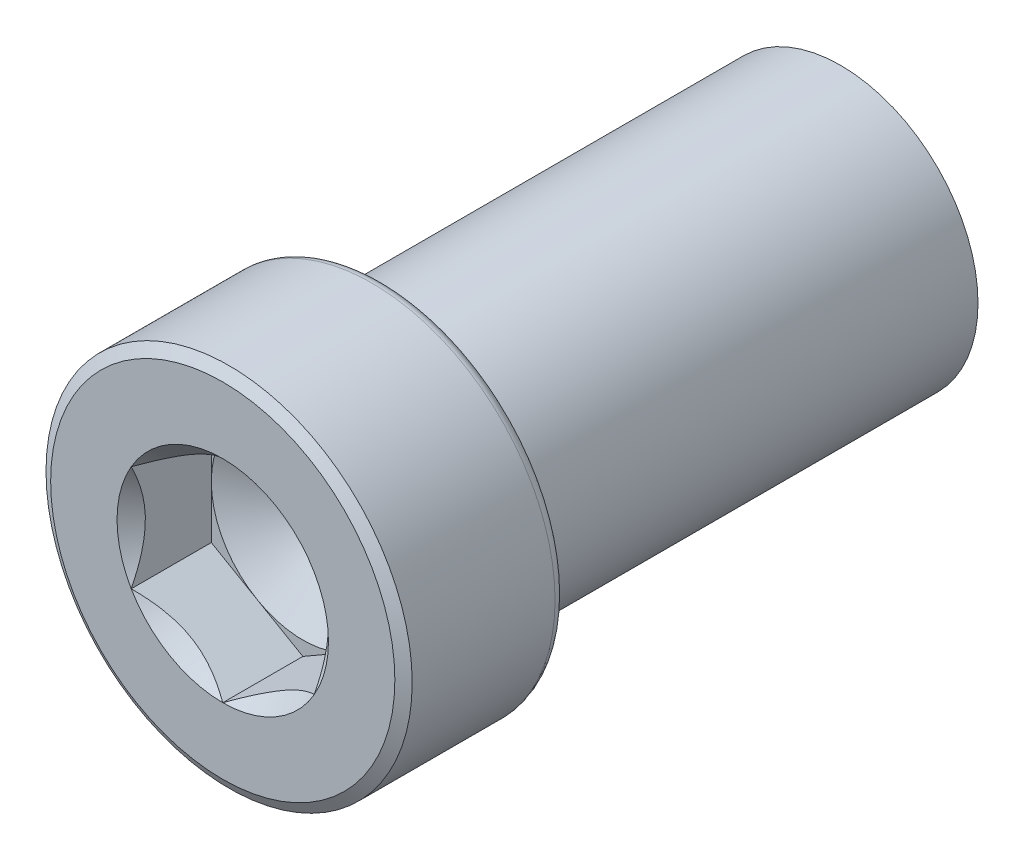
ISO-10303-21;
HEADER;
FILE_DESCRIPTION(('STEP AP214'),'2;1');
FILE_NAME('part.step','',(''),(''),'','','');
FILE_SCHEMA(('AUTOMOTIVE_DESIGN { 1 0 10303 214 1 1 1 1 }'));
ENDSEC;
DATA;
#1=APPLICATION_CONTEXT('core data for automotive mechanical design processes');
#2=APPLICATION_PROTOCOL_DEFINITION('international standard','automotive_design',2000,#1);
#3=PRODUCT_CONTEXT('',#1,'mechanical');
#4=PRODUCT('Part','Part','',(#3));
#5=PRODUCT_RELATED_PRODUCT_CATEGORY('part','',(#4));
#6=PRODUCT_DEFINITION_FORMATION('','',#4);
#7=PRODUCT_DEFINITION_CONTEXT('part definition',#1,'design');
#8=PRODUCT_DEFINITION('design','',#6,#7);
#9=PRODUCT_DEFINITION_SHAPE('','',#8);
#10=(LENGTH_UNIT() NAMED_UNIT(*) SI_UNIT(.MILLI.,.METRE.));
#11=(NAMED_UNIT(*) PLANE_ANGLE_UNIT() SI_UNIT($,.RADIAN.));
#12=(NAMED_UNIT(*) SI_UNIT($,.STERADIAN.) SOLID_ANGLE_UNIT());
#13=UNCERTAINTY_MEASURE_WITH_UNIT(LENGTH_MEASURE(1.E-05),#10,'distance_accuracy_value','');
#14=(GEOMETRIC_REPRESENTATION_CONTEXT(3) GLOBAL_UNCERTAINTY_ASSIGNED_CONTEXT((#13)) GLOBAL_UNIT_ASSIGNED_CONTEXT((#10,
#11,#12)) REPRESENTATION_CONTEXT('',''));
#15=CARTESIAN_POINT('',(0.,0.,0.));
#16=DIRECTION('',(0.,0.,1.));
#17=DIRECTION('',(1.,0.,0.));
#18=AXIS2_PLACEMENT_3D('',#15,#16,#17);
#19=CARTESIAN_POINT('',(-8.00000000000001,0.,3.5));
#20=DIRECTION('',(0.,0.,-1.));
#21=DIRECTION('',(-0.999999999999999,0.,0.));
#22=AXIS2_PLACEMENT_3D('',#19,#20,#21);
#23=PLANE('',#22);
#24=CARTESIAN_POINT('',(0.,0.,3.5));
#25=DIRECTION('',(0.,0.,1.));
#26=DIRECTION('',(0.999999999999999,0.,0.));
#27=AXIS2_PLACEMENT_3D('',#24,#25,#26);
#28=CIRCLE('',#27,4.);
#29=CARTESIAN_POINT('',(4.,0.,3.5));
#30=VERTEX_POINT('',#29);
#31=CARTESIAN_POINT('',(2.,3.46410161513773,3.5));
#32=VERTEX_POINT('',#31);
#33=EDGE_CURVE('E61',#30,#32,#28,.T.);
#34=ORIENTED_EDGE('',*,*,#33,.F.);
#35=DIRECTION('',(0.,1.,0.));
#36=VECTOR('',#35,1.);
#37=CARTESIAN_POINT('',(4.,-2.3094010767585,3.5));
#38=LINE('',#37,#36);
#39=CARTESIAN_POINT('',(4.,2.3094010767585,3.5));
#40=VERTEX_POINT('',#39);
#41=EDGE_CURVE('E131',#30,#40,#38,.T.);
#42=ORIENTED_EDGE('',*,*,#41,.T.);
#43=DIRECTION('',(-0.866025403784438,0.5,0.));
#44=VECTOR('',#43,1.);
#45=CARTESIAN_POINT('',(4.,2.3094010767585,3.5));
#46=LINE('',#45,#44);
#47=EDGE_CURVE('E134',#40,#32,#46,.T.);
#48=ORIENTED_EDGE('',*,*,#47,.T.);
#49=EDGE_LOOP('',(#34,#42,#48));
#50=FACE_BOUND('',#49,.T.);
#51=ADVANCED_FACE('F50',(#50),#23,.F.);
#52=CARTESIAN_POINT('',(-2.,3.4641016151377,3.5));
#53=VERTEX_POINT('',#52);
#54=EDGE_CURVE('E13',#32,#53,#28,.T.);
#55=ORIENTED_EDGE('',*,*,#54,.F.);
#56=CARTESIAN_POINT('',(0.,4.61880215351694,3.5));
#57=VERTEX_POINT('',#56);
#58=EDGE_CURVE('E148',#32,#57,#46,.T.);
#59=ORIENTED_EDGE('',*,*,#58,.T.);
#60=DIRECTION('',(-0.866025403784438,-0.5,0.));
#61=VECTOR('',#60,1.);
#62=CARTESIAN_POINT('',(0.,4.61880215351694,3.5));
#63=LINE('',#62,#61);
#64=EDGE_CURVE('E154',#57,#53,#63,.T.);
#65=ORIENTED_EDGE('',*,*,#64,.T.);
#66=EDGE_LOOP('',(#55,#59,#65));
#67=FACE_BOUND('',#66,.T.);
#68=ADVANCED_FACE('F212',(#67),#23,.F.);
#69=CARTESIAN_POINT('',(-4.,0.,3.5));
#70=VERTEX_POINT('',#69);
#71=EDGE_CURVE('E59',#53,#70,#28,.T.);
#72=ORIENTED_EDGE('',*,*,#71,.F.);
#73=CARTESIAN_POINT('',(-4.,2.3094010767585,3.5));
#74=VERTEX_POINT('',#73);
#75=EDGE_CURVE('E153',#53,#74,#63,.T.);
#76=ORIENTED_EDGE('',*,*,#75,.T.);
#77=DIRECTION('',(0.,-1.,0.));
#78=VECTOR('',#77,1.);
#79=CARTESIAN_POINT('',(-4.,2.3094010767585,3.5));
#80=LINE('',#79,#78);
#81=EDGE_CURVE('E158',#74,#70,#80,.T.);
#82=ORIENTED_EDGE('',*,*,#81,.T.);
#83=EDGE_LOOP('',(#72,#76,#82));
#84=FACE_BOUND('',#83,.T.);
#85=ADVANCED_FACE('F217',(#84),#23,.F.);
#86=CARTESIAN_POINT('',(-2.,-3.46410161513776,3.5));
#87=VERTEX_POINT('',#86);
#88=EDGE_CURVE('E241',#70,#87,#28,.T.);
#89=ORIENTED_EDGE('',*,*,#88,.F.);
#90=CARTESIAN_POINT('',(-4.,-2.3094010767585,3.5));
#91=VERTEX_POINT('',#90);
#92=EDGE_CURVE('E157',#70,#91,#80,.T.);
#93=ORIENTED_EDGE('',*,*,#92,.T.);
#94=DIRECTION('',(0.866025403784438,-0.5,0.));
#95=VECTOR('',#94,1.);
#96=CARTESIAN_POINT('',(-4.,-2.3094010767585,3.5));
#97=LINE('',#96,#95);
#98=EDGE_CURVE('E246',#91,#87,#97,.T.);
#99=ORIENTED_EDGE('',*,*,#98,.T.);
#100=EDGE_LOOP('',(#89,#93,#99));
#101=FACE_BOUND('',#100,.T.);
#102=ADVANCED_FACE('F230',(#101),#23,.F.);
#103=CARTESIAN_POINT('',(2.,-3.46410161513776,3.5));
#104=VERTEX_POINT('',#103);
#105=EDGE_CURVE('E68',#87,#104,#28,.T.);
#106=ORIENTED_EDGE('',*,*,#105,.F.);
#107=CARTESIAN_POINT('',(0.,-4.61880215351701,3.5));
#108=VERTEX_POINT('',#107);
#109=EDGE_CURVE('E238',#87,#108,#97,.T.);
#110=ORIENTED_EDGE('',*,*,#109,.T.);
#111=DIRECTION('',(0.866025403784438,0.5,0.));
#112=VECTOR('',#111,1.);
#113=CARTESIAN_POINT('',(0.,-4.61880215351701,3.5));
#114=LINE('',#113,#112);
#115=EDGE_CURVE('E143',#108,#104,#114,.T.);
#116=ORIENTED_EDGE('',*,*,#115,.T.);
#117=EDGE_LOOP('',(#106,#110,#116));
#118=FACE_BOUND('',#117,.T.);
#119=ADVANCED_FACE('F222',(#118),#23,.F.);
#120=EDGE_CURVE('E121',#104,#30,#28,.T.);
#121=ORIENTED_EDGE('',*,*,#120,.F.);
#122=CARTESIAN_POINT('',(4.,-2.3094010767585,3.5));
#123=VERTEX_POINT('',#122);
#124=EDGE_CURVE('E146',#104,#123,#114,.T.);
#125=ORIENTED_EDGE('',*,*,#124,.T.);
#126=EDGE_CURVE('E139',#123,#30,#38,.T.);
#127=ORIENTED_EDGE('',*,*,#126,.T.);
#128=EDGE_LOOP('',(#121,#125,#127));
#129=FACE_BOUND('',#128,.T.);
#130=ADVANCED_FACE('F145',(#129),#23,.F.);
#131=CARTESIAN_POINT('',(0.,0.,0.));
#132=DIRECTION('',(0.,0.,-1.));
#133=DIRECTION('',(0.,1.,0.));
#134=AXIS2_PLACEMENT_3D('',#131,#132,#133);
#135=CYLINDRICAL_SURFACE('',#134,6.);
#136=CARTESIAN_POINT('',(0.,0.,0.));
#137=DIRECTION('',(0.,0.,1.));
#138=DIRECTION('',(0.999999999999999,0.,0.));
#139=AXIS2_PLACEMENT_3D('',#136,#137,#138);
#140=CIRCLE('',#139,6.);
#141=CARTESIAN_POINT('',(5.99999999999999,0.,0.));
#142=VERTEX_POINT('',#141);
#143=EDGE_CURVE('E165',#142,#142,#140,.F.);
#144=ORIENTED_EDGE('',*,*,#143,.T.);
#145=EDGE_LOOP('',(#144));
#146=FACE_BOUND('',#145,.T.);
#147=CARTESIAN_POINT('',(0.,0.,-20.));
#148=DIRECTION('',(0.,0.,-1.));
#149=DIRECTION('',(0.,1.,0.));
#150=AXIS2_PLACEMENT_3D('',#147,#148,#149);
#151=CIRCLE('',#150,6.);
#152=CARTESIAN_POINT('',(0.,6.,-20.));
#153=VERTEX_POINT('',#152);
#154=EDGE_CURVE('E179',#153,#153,#151,.T.);
#155=ORIENTED_EDGE('',*,*,#154,.F.);
#156=EDGE_LOOP('',(#155));
#157=FACE_BOUND('',#156,.T.);
#158=ADVANCED_FACE('F221',(#146,#157),#135,.T.);
#159=CARTESIAN_POINT('',(0.,0.,-20.));
#160=DIRECTION('',(0.,0.,-1.));
#161=DIRECTION('',(0.,1.,0.));
#162=AXIS2_PLACEMENT_3D('',#159,#160,#161);
#163=PLANE('',#162);
#164=ORIENTED_EDGE('',*,*,#154,.T.);
#165=EDGE_LOOP('',(#164));
#166=FACE_BOUND('',#165,.T.);
#167=ADVANCED_FACE('F227',(#166),#163,.T.);
#168=CARTESIAN_POINT('',(0.,0.,7.));
#169=DIRECTION('',(0.,0.,-1.));
#170=DIRECTION('',(-0.999999999999999,0.,0.));
#171=AXIS2_PLACEMENT_3D('',#168,#169,#170);
#172=CYLINDRICAL_SURFACE('',#171,8.);
#173=CARTESIAN_POINT('',(0.,0.,6.72287187078898));
#174=DIRECTION('',(0.,0.,1.));
#175=DIRECTION('',(0.999999999999999,0.,0.));
#176=AXIS2_PLACEMENT_3D('',#173,#174,#175);
#177=CIRCLE('',#176,8.);
#178=CARTESIAN_POINT('',(7.99999999999999,0.,6.72287187078898));
#179=VERTEX_POINT('',#178);
#180=EDGE_CURVE('E54',#179,#179,#177,.F.);
#181=ORIENTED_EDGE('',*,*,#180,.T.);
#182=EDGE_LOOP('',(#181));
#183=FACE_BOUND('',#182,.T.);
#184=CARTESIAN_POINT('',(0.,0.,0.480000000000001));
#185=DIRECTION('',(0.,0.,1.));
#186=DIRECTION('',(0.999999999999999,0.,0.));
#187=AXIS2_PLACEMENT_3D('',#184,#185,#186);
#188=CIRCLE('',#187,8.);
#189=CARTESIAN_POINT('',(7.99999999999999,0.,0.480000000000001));
#190=VERTEX_POINT('',#189);
#191=EDGE_CURVE('E182',#190,#190,#188,.T.);
#192=ORIENTED_EDGE('',*,*,#191,.T.);
#193=EDGE_LOOP('',(#192));
#194=FACE_BOUND('',#193,.T.);
#195=ADVANCED_FACE('F194',(#183,#194),#172,.T.);
#196=CARTESIAN_POINT('',(0.,0.,7.));
#197=DIRECTION('',(0.,0.,1.));
#198=DIRECTION('',(0.999999999999999,0.,0.));
#199=AXIS2_PLACEMENT_3D('',#196,#197,#198);
#200=PLANE('',#199);
#201=CARTESIAN_POINT('',(0.,0.,7.));
#202=DIRECTION('',(0.,0.,1.));
#203=DIRECTION('',(0.999999999999999,0.,0.));
#204=AXIS2_PLACEMENT_3D('',#201,#202,#203);
#205=CIRCLE('',#204,4.61880215351701);
#206=CARTESIAN_POINT('',(4.,2.3094010767585,6.99999999999999));
#207=VERTEX_POINT('',#206);
#208=CARTESIAN_POINT('',(0.,4.61880215351697,6.99999999999999));
#209=VERTEX_POINT('',#208);
#210=EDGE_CURVE('E332',#207,#209,#205,.T.);
#211=ORIENTED_EDGE('',*,*,#210,.F.);
#212=CARTESIAN_POINT('',(4.,-2.3094010767585,7.));
#213=VERTEX_POINT('',#212);
#214=EDGE_CURVE('E330',#213,#207,#205,.T.);
#215=ORIENTED_EDGE('',*,*,#214,.F.);
#216=CARTESIAN_POINT('',(0.,-4.61880215351701,7.));
#217=VERTEX_POINT('',#216);
#218=EDGE_CURVE('E326',#217,#213,#205,.T.);
#219=ORIENTED_EDGE('',*,*,#218,.F.);
#220=CARTESIAN_POINT('',(-4.,-2.3094010767585,7.00000000000001));
#221=VERTEX_POINT('',#220);
#222=EDGE_CURVE('E329',#221,#217,#205,.T.);
#223=ORIENTED_EDGE('',*,*,#222,.F.);
#224=CARTESIAN_POINT('',(-4.,2.3094010767585,7.));
#225=VERTEX_POINT('',#224);
#226=EDGE_CURVE('E75',#225,#221,#205,.T.);
#227=ORIENTED_EDGE('',*,*,#226,.F.);
#228=EDGE_CURVE('E334',#209,#225,#205,.T.);
#229=ORIENTED_EDGE('',*,*,#228,.F.);
#230=EDGE_LOOP('',(#211,#215,#219,#223,#227,#229));
#231=FACE_BOUND('',#230,.T.);
#232=CARTESIAN_POINT('',(0.,0.,7.));
#233=DIRECTION('',(0.,0.,1.));
#234=DIRECTION('',(0.999999999999999,0.,0.));
#235=AXIS2_PLACEMENT_3D('',#232,#233,#234);
#236=CIRCLE('',#235,7.52);
#237=CARTESIAN_POINT('',(7.51999999999999,0.,7.));
#238=VERTEX_POINT('',#237);
#239=EDGE_CURVE('E187',#238,#238,#236,.T.);
#240=ORIENTED_EDGE('',*,*,#239,.T.);
#241=EDGE_LOOP('',(#240));
#242=FACE_BOUND('',#241,.T.);
#243=ADVANCED_FACE('F328',(#231,#242),#200,.T.);
#244=CARTESIAN_POINT('',(0.,0.,0.));
#245=DIRECTION('',(0.,0.,1.));
#246=DIRECTION('',(0.999999999999999,0.,0.));
#247=AXIS2_PLACEMENT_3D('',#244,#245,#246);
#248=PLANE('',#247);
#249=CARTESIAN_POINT('',(0.,0.,0.));
#250=DIRECTION('',(0.,0.,1.));
#251=DIRECTION('',(0.999999999999999,0.,0.));
#252=AXIS2_PLACEMENT_3D('',#249,#250,#251);
#253=CIRCLE('',#252,7.52);
#254=CARTESIAN_POINT('',(7.52,0.,0.));
#255=VERTEX_POINT('',#254);
#256=EDGE_CURVE('E185',#255,#255,#253,.F.);
#257=ORIENTED_EDGE('',*,*,#256,.T.);
#258=EDGE_LOOP('',(#257));
#259=FACE_BOUND('',#258,.T.);
#260=ORIENTED_EDGE('',*,*,#143,.F.);
#261=EDGE_LOOP('',(#260));
#262=FACE_BOUND('',#261,.T.);
#263=ADVANCED_FACE('F209',(#259,#262),#248,.F.);
#264=CARTESIAN_POINT('',(0.,0.,0.480000000000001));
#265=DIRECTION('',(0.,0.,1.));
#266=DIRECTION('',(0.999999999999999,0.,0.));
#267=AXIS2_PLACEMENT_3D('',#264,#265,#266);
#268=TOROIDAL_SURFACE('',#267,7.52,0.48);
#269=ORIENTED_EDGE('',*,*,#256,.F.);
#270=EDGE_LOOP('',(#269));
#271=FACE_BOUND('',#270,.T.);
#272=ORIENTED_EDGE('',*,*,#191,.F.);
#273=EDGE_LOOP('',(#272));
#274=FACE_BOUND('',#273,.T.);
#275=ADVANCED_FACE('F200',(#271,#274),#268,.T.);
#276=CARTESIAN_POINT('',(0.,0.,7.));
#277=DIRECTION('',(0.,0.,-1.));
#278=DIRECTION('',(-0.999999999999999,0.,0.));
#279=AXIS2_PLACEMENT_3D('',#276,#277,#278);
#280=CONICAL_SURFACE('',#279,7.52,1.0471975511966);
#281=ORIENTED_EDGE('',*,*,#180,.F.);
#282=EDGE_LOOP('',(#281));
#283=FACE_BOUND('',#282,.T.);
#284=ORIENTED_EDGE('',*,*,#239,.F.);
#285=EDGE_LOOP('',(#284));
#286=FACE_BOUND('',#285,.T.);
#287=ADVANCED_FACE('F52',(#283,#286),#280,.T.);
#288=CARTESIAN_POINT('',(0.,0.,7.));
#289=DIRECTION('',(0.,0.,1.));
#290=DIRECTION('',(0.999999999999999,0.,0.));
#291=AXIS2_PLACEMENT_3D('',#288,#289,#290);
#292=CONICAL_SURFACE('',#291,4.61880215351701,0.78539816339745);
#293=ORIENTED_EDGE('',*,*,#218,.T.);
#294=CARTESIAN_POINT('',(-0.000200000000005751,-4.61891762357085,7.00011547438386));
#295=CARTESIAN_POINT('',(0.0685809847183788,-4.57920690352856,6.96040885595756));
#296=CARTESIAN_POINT('',(0.137888304896497,-4.53919230356692,6.92192041711315));
#297=CARTESIAN_POINT('',(0.27766403676359,-4.45849274714727,6.84775122373551));
#298=CARTESIAN_POINT('',(0.348133057578701,-4.41780743901014,6.81207200273165));
#299=CARTESIAN_POINT('',(0.562100081603898,-4.29427352009149,6.709500867651));
#300=CARTESIAN_POINT('',(0.707416589267741,-4.21037499527407,6.64751311101257));
#301=CARTESIAN_POINT('',(1.00040214981325,-4.04121970302445,6.54135586900941));
#302=CARTESIAN_POINT('',(1.14799719663764,-3.95600566300934,6.49691905545344));
#303=CARTESIAN_POINT('',(1.44644641508886,-3.78369592639708,6.42844898212945));
#304=CARTESIAN_POINT('',(1.59729144640343,-3.69660550696169,6.4043646378613));
#305=CARTESIAN_POINT('',(1.85726690511356,-3.54650860589271,6.38263488086053));
#306=CARTESIAN_POINT('',(1.96606238220553,-3.48369550790705,6.37941891464086));
#307=CARTESIAN_POINT('',(2.18347675426333,-3.35817126167379,6.384840058225));
#308=CARTESIAN_POINT('',(2.29209557396636,-3.29546015687918,6.39348132317183));
#309=CARTESIAN_POINT('',(2.50830402737816,-3.17063214810081,6.42212403849644));
#310=CARTESIAN_POINT('',(2.61589237292034,-3.10851598784036,6.44213819455127));
#311=CARTESIAN_POINT('',(2.82922129322136,-2.98535047827864,6.49243415736466));
#312=CARTESIAN_POINT('',(2.93496200899966,-2.92430104755974,6.52271517687837));
#313=CARTESIAN_POINT('',(3.12267722089178,-2.81592361944283,6.58501525269423));
#314=CARTESIAN_POINT('',(3.20506731843132,-2.76835567444982,6.61539627986011));
#315=CARTESIAN_POINT('',(3.3683684620413,-2.67407371522762,6.68105446456035));
#316=CARTESIAN_POINT('',(3.44927946303277,-2.62735972702479,6.71633177103979));
#317=CARTESIAN_POINT('',(3.60936749601014,-2.53493285809127,6.79099168702093));
#318=CARTESIAN_POINT('',(3.68854908118625,-2.48921734857499,6.83036138700361));
#319=CARTESIAN_POINT('',(3.84544590098816,-2.39863292742735,6.9126891081433));
#320=CARTESIAN_POINT('',(3.92316199986077,-2.35376351682288,6.95564492780196));
#321=CARTESIAN_POINT('',(4.00020000000001,-2.30928560670467,7.00011547438386));
#322=B_SPLINE_CURVE_WITH_KNOTS('',3,(#294,#295,#296,#297,#298,#299,#300,#301,#302,#303,#304,
#305,#306,#307,#308,#309,#310,#311,#312,#313,#314,#315,#316,#317,#318,#319,#320,#321),
.UNSPECIFIED.,.F.,.F.,(4,2,2,2,2,2,2,2,2,2,2,2,2,4),(0.,0.266361961703663,0.53286833440011,
1.06875865685462,1.59613884594051,2.1221913505558,2.49866160599658,2.87526382203495,
3.25228760372078,3.62928248242859,3.92874944437162,4.22822551811346,4.52678401907575,
4.82516056577923),.UNSPECIFIED.);
#323=EDGE_CURVE('E276',#217,#213,#322,.T.);
#324=ORIENTED_EDGE('',*,*,#323,.F.);
#325=EDGE_LOOP('',(#293,#324));
#326=FACE_BOUND('',#325,.T.);
#327=ADVANCED_FACE('F199',(#326),#292,.F.);
#328=ORIENTED_EDGE('',*,*,#214,.T.);
#329=CARTESIAN_POINT('',(4.,-4.37463933375833,8.30888452009063));
#330=CARTESIAN_POINT('',(4.,-4.2670160649694,8.22947667475692));
#331=CARTESIAN_POINT('',(4.,-4.15876523216898,8.15090501157546));
#332=CARTESIAN_POINT('',(4.,-3.9407712074628,7.99579964132186));
#333=CARTESIAN_POINT('',(4.,-3.83102762324232,7.91926648626467));
#334=CARTESIAN_POINT('',(4.,-3.60901103127983,7.76806284377808));
#335=CARTESIAN_POINT('',(4.,-3.49672500954859,7.69341139774675));
#336=CARTESIAN_POINT('',(4.,-3.27021099752782,7.54712453682474));
#337=CARTESIAN_POINT('',(4.,-3.1559831501175,7.47548890136806));
#338=CARTESIAN_POINT('',(4.,-2.91947098810371,7.33235955025793));
#339=CARTESIAN_POINT('',(4.,-2.79707115503739,7.26105574026758));
#340=CARTESIAN_POINT('',(4.,-2.54944430759389,7.12346173487588));
#341=CARTESIAN_POINT('',(4.,-2.42421688009315,7.05717227832843));
#342=CARTESIAN_POINT('',(4.,-2.17099781328357,6.9310566000671));
#343=CARTESIAN_POINT('',(4.,-2.04301569826031,6.87121140502895));
#344=CARTESIAN_POINT('',(4.,-1.78371374887448,6.75932153617152));
#345=CARTESIAN_POINT('',(4.,-1.65239537977961,6.70727350484524));
#346=CARTESIAN_POINT('',(4.,-1.39402694173445,6.61553313746322));
#347=CARTESIAN_POINT('',(4.,-1.26717128946051,6.57529913216074));
#348=CARTESIAN_POINT('',(4.,-1.01060861403715,6.50504590436412));
#349=CARTESIAN_POINT('',(4.,-0.880901375947651,6.47502745470371));
#350=CARTESIAN_POINT('',(4.,-0.621460749878914,6.42721386480443));
#351=CARTESIAN_POINT('',(4.,-0.491764061621996,6.40922273824688));
#352=CARTESIAN_POINT('',(4.,-0.231237208965902,6.38577719200083));
#353=CARTESIAN_POINT('',(4.,-0.100407203591596,6.38032104114022));
#354=CARTESIAN_POINT('',(4.,0.157347392758043,6.3822764067893));
#355=CARTESIAN_POINT('',(4.,0.284274982455069,6.38931856656401));
#356=CARTESIAN_POINT('',(4.,0.536926739875115,6.41511494442127));
#357=CARTESIAN_POINT('',(4.,0.662650782817757,6.43387036383109));
#358=CARTESIAN_POINT('',(4.,0.91410884078402,6.48243029589702));
#359=CARTESIAN_POINT('',(4.,1.03980747479884,6.51241529839682));
#360=CARTESIAN_POINT('',(4.,1.28849002427906,6.58190509636532));
#361=CARTESIAN_POINT('',(4.,1.41147423967593,6.62140883424833));
#362=CARTESIAN_POINT('',(4.,1.67152283261783,6.71447023059114));
#363=CARTESIAN_POINT('',(4.,1.80815694056916,6.7692198303238));
#364=CARTESIAN_POINT('',(4.,2.07782085923879,6.88704023361446));
#365=CARTESIAN_POINT('',(4.,2.21084887874244,6.95011508439279));
#366=CARTESIAN_POINT('',(4.,2.47398342394641,7.08307634387658));
#367=CARTESIAN_POINT('',(4.,2.60407878943841,7.15298466257881));
#368=CARTESIAN_POINT('',(4.,2.86125620587211,7.29805833583712));
#369=CARTESIAN_POINT('',(4.,2.98833875336046,7.37322281593869));
#370=CARTESIAN_POINT('',(4.,3.233550601183,7.52385992414633));
#371=CARTESIAN_POINT('',(4.,3.35180792350919,7.59912525226169));
#372=CARTESIAN_POINT('',(4.,3.58629562916117,7.75275961187118));
#373=CARTESIAN_POINT('',(4.,3.70252585608415,7.83112888134079));
#374=CARTESIAN_POINT('',(4.,3.93227175029453,7.98975378926917));
#375=CARTESIAN_POINT('',(4.,4.04580190455291,8.06998852009989));
#376=CARTESIAN_POINT('',(4.,4.27132072404531,8.23253406868798));
#377=CARTESIAN_POINT('',(4.,4.38330980240368,8.31484431260599));
#378=CARTESIAN_POINT('',(4.,4.49465533631831,8.39800153218644));
#379=B_SPLINE_CURVE_WITH_KNOTS('',3,(#329,#330,#331,#332,#333,#334,#335,#336,#337,#338,#339,
#340,#341,#342,#343,#344,#345,#346,#347,#348,#349,#350,#351,#352,#353,#354,#355,#356,#357,#358,
#359,#360,#361,#362,#363,#364,#365,#366,#367,#368,#369,#370,#371,#372,#373,#374,#375,#376,#377,
#378),.UNSPECIFIED.,.F.,.F.,(4,2,2,2,2,2,2,2,2,2,2,2,2,2,2,2,2,2,2,2,2,2,2,2,4),(0.,
0.401250877652813,0.802609329001025,1.20707948660625,1.61152001108435,2.03638751941652,
2.46131750958141,2.88496007967785,3.30841969903683,3.70731004668018,4.10623056472589,
4.49848097188877,4.8906772031353,5.27147527594922,5.65231241032827,6.03955340619414,
6.42675139720329,6.86798548238096,7.30943486370261,7.75234922586597,8.19519007597441,
8.61566464356928,9.03617151108871,9.45320773226454,9.8701298885597),.UNSPECIFIED.);
#380=EDGE_CURVE('E284',#213,#207,#379,.T.);
#381=ORIENTED_EDGE('',*,*,#380,.F.);
#382=EDGE_LOOP('',(#328,#381));
#383=FACE_BOUND('',#382,.T.);
#384=ADVANCED_FACE('F205',(#383),#292,.F.);
#385=ORIENTED_EDGE('',*,*,#210,.T.);
#386=CARTESIAN_POINT('',(4.00020000000001,2.30928560670467,7.00011547438385));
#387=CARTESIAN_POINT('',(3.93141901528162,2.34899632674695,6.96040885595756));
#388=CARTESIAN_POINT('',(3.8621116951035,2.3890109267086,6.92192041711315));
#389=CARTESIAN_POINT('',(3.72233596323641,2.46971048312824,6.84775122373551));
#390=CARTESIAN_POINT('',(3.6518669424213,2.51039579126538,6.81207200273165));
#391=CARTESIAN_POINT('',(3.43789991839611,2.63392971018403,6.709500867651));
#392=CARTESIAN_POINT('',(3.29258341073226,2.71782823500144,6.64751311101257));
#393=CARTESIAN_POINT('',(2.99959785018675,2.88698352725106,6.54135586900941));
#394=CARTESIAN_POINT('',(2.85200280336237,2.97219756726618,6.49691905545344));
#395=CARTESIAN_POINT('',(2.55355358491114,3.14450730387843,6.42844898212945));
#396=CARTESIAN_POINT('',(2.40270855359657,3.23159772331381,6.4043646378613));
#397=CARTESIAN_POINT('',(2.14273309488645,3.38169462438279,6.38263488086053));
#398=CARTESIAN_POINT('',(2.03393761779448,3.44450772236846,6.37941891464086));
#399=CARTESIAN_POINT('',(1.81652324573668,3.57003196860173,6.384840058225));
#400=CARTESIAN_POINT('',(1.70790442603365,3.63274307339633,6.39348132317183));
#401=CARTESIAN_POINT('',(1.49169597262184,3.75757108217471,6.42212403849643));
#402=CARTESIAN_POINT('',(1.38410762707966,3.81968724243515,6.44213819455127));
#403=CARTESIAN_POINT('',(1.17077870677865,3.94285275199687,6.49243415736465));
#404=CARTESIAN_POINT('',(1.06503799100035,4.00390218271578,6.52271517687837));
#405=CARTESIAN_POINT('',(0.877322779108229,4.11227961083268,6.58501525269423));
#406=CARTESIAN_POINT('',(0.794932681568683,4.1598475558257,6.61539627986011));
#407=CARTESIAN_POINT('',(0.631631537958703,4.25412951504789,6.68105446456034));
#408=CARTESIAN_POINT('',(0.550720536967236,4.30084350325072,6.71633177103978));
#409=CARTESIAN_POINT('',(0.390632503989868,4.39327037218424,6.79099168702092));
#410=CARTESIAN_POINT('',(0.311450918813765,4.43898588170053,6.8303613870036));
#411=CARTESIAN_POINT('',(0.154554099011848,4.52957030284816,6.91268910814329));
#412=CARTESIAN_POINT('',(0.0768380001392364,4.57443971345262,6.95564492780195));
#413=CARTESIAN_POINT('',(-0.000200000000005751,4.61891762357082,7.00011547438385));
#414=B_SPLINE_CURVE_WITH_KNOTS('',3,(#386,#387,#388,#389,#390,#391,#392,#393,#394,#395,#396,
#397,#398,#399,#400,#401,#402,#403,#404,#405,#406,#407,#408,#409,#410,#411,#412,#413),
.UNSPECIFIED.,.F.,.F.,(4,2,2,2,2,2,2,2,2,2,2,2,2,4),(0.,0.266361961703661,0.532868334400107,
1.06875865685461,1.5961388459405,2.12219135055579,2.49866160599657,2.87526382203494,
3.25228760372077,3.62928248242859,3.92874944437162,4.22822551811345,4.52678401907573,
4.82516056577921),.UNSPECIFIED.);
#415=EDGE_CURVE('E291',#207,#209,#414,.T.);
#416=ORIENTED_EDGE('',*,*,#415,.F.);
#417=EDGE_LOOP('',(#385,#416));
#418=FACE_BOUND('',#417,.T.);
#419=ADVANCED_FACE('F367',(#418),#292,.F.);
#420=ORIENTED_EDGE('',*,*,#228,.T.);
#421=CARTESIAN_POINT('',(0.000200000000005751,4.61891762357082,7.00011547438385));
#422=CARTESIAN_POINT('',(-0.0685809847183587,4.57920690352852,6.96040885595753));
#423=CARTESIAN_POINT('',(-0.13788830489647,4.53919230356686,6.9219204171131));
#424=CARTESIAN_POINT('',(-0.27766403676356,4.45849274714722,6.84775122373545));
#425=CARTESIAN_POINT('',(-0.348133057578675,4.41780743901008,6.81207200273159));
#426=CARTESIAN_POINT('',(-0.562100081603877,4.29427352009143,6.70950086765094));
#427=CARTESIAN_POINT('',(-0.707416589267717,4.21037499527402,6.64751311101251));
#428=CARTESIAN_POINT('',(-1.00040214981322,4.04121970302439,6.54135586900934));
#429=CARTESIAN_POINT('',(-1.14799719663761,3.95600566300928,6.49691905545336));
#430=CARTESIAN_POINT('',(-1.44644641508884,3.78369592639703,6.42844898212941));
#431=CARTESIAN_POINT('',(-1.59729144640343,3.69660550696166,6.40436463786131));
#432=CARTESIAN_POINT('',(-1.85726690511356,3.54650860589266,6.38263488086052));
#433=CARTESIAN_POINT('',(-1.96606238220552,3.48369550790699,6.37941891464081));
#434=CARTESIAN_POINT('',(-2.18347675426332,3.35817126167372,6.38484005822493));
#435=CARTESIAN_POINT('',(-2.29209557396635,3.29546015687913,6.39348132317177));
#436=CARTESIAN_POINT('',(-2.50830402737815,3.17063214810074,6.42212403849638));
#437=CARTESIAN_POINT('',(-2.61589237292032,3.10851598784029,6.4421381945512));
#438=CARTESIAN_POINT('',(-2.82922129322134,2.9853504782786,6.49243415736461));
#439=CARTESIAN_POINT('',(-2.93496200899966,2.92430104755974,6.52271517687836));
#440=CARTESIAN_POINT('',(-3.12267722089178,2.81592361944283,6.58501525269422));
#441=CARTESIAN_POINT('',(-3.20506731843131,2.76835567444977,6.61539627986007));
#442=CARTESIAN_POINT('',(-3.36836846204128,2.67407371522754,6.68105446456028));
#443=CARTESIAN_POINT('',(-3.44927946303276,2.62735972702473,6.71633177103973));
#444=CARTESIAN_POINT('',(-3.60936749601013,2.53493285809121,6.79099168702088));
#445=CARTESIAN_POINT('',(-3.68854908118623,2.48921734857492,6.83036138700356));
#446=CARTESIAN_POINT('',(-3.84544590098815,2.3986329274273,6.91268910814326));
#447=CARTESIAN_POINT('',(-3.92316199986076,2.35376351682284,6.95564492780192));
#448=CARTESIAN_POINT('',(-4.00020000000001,2.30928560670467,7.00011547438385));
#449=B_SPLINE_CURVE_WITH_KNOTS('',3,(#421,#422,#423,#424,#425,#426,#427,#428,#429,#430,#431,
#432,#433,#434,#435,#436,#437,#438,#439,#440,#441,#442,#443,#444,#445,#446,#447,#448),
.UNSPECIFIED.,.F.,.F.,(4,2,2,2,2,2,2,2,2,2,2,2,2,4),(0.,0.266361961703674,0.532868334400128,
1.06875865685463,1.59613884594052,2.12219135055582,2.49866160599661,2.87526382203497,
3.25228760372079,3.62928248242861,3.92874944437164,4.22822551811348,4.52678401907577,
4.82516056577925),.UNSPECIFIED.);
#450=EDGE_CURVE('E296',#209,#225,#449,.T.);
#451=ORIENTED_EDGE('',*,*,#450,.F.);
#452=EDGE_LOOP('',(#420,#451));
#453=FACE_BOUND('',#452,.T.);
#454=ADVANCED_FACE('F358',(#453),#292,.F.);
#455=ORIENTED_EDGE('',*,*,#226,.T.);
#456=CARTESIAN_POINT('',(-4.,-4.37463932603434,8.3088845143903));
#457=CARTESIAN_POINT('',(-4.,-4.26701605745412,8.22947666927441));
#458=CARTESIAN_POINT('',(-4.,-4.15876522486311,8.15090500631047));
#459=CARTESIAN_POINT('',(-4.,-3.94077120057801,7.99579963649069));
#460=CARTESIAN_POINT('',(-4.,-3.83102761656921,7.9192664816498));
#461=CARTESIAN_POINT('',(-4.,-3.60901102503733,7.76806283959723));
#462=CARTESIAN_POINT('',(-4.,-3.4967250035251,7.69341139378357));
#463=CARTESIAN_POINT('',(-4.,-3.27021099194652,7.54712453329338));
#464=CARTESIAN_POINT('',(-4.,-3.15598314475939,7.47548889805085));
#465=CARTESIAN_POINT('',(-4.,-2.91947098322643,7.33235954738482));
#466=CARTESIAN_POINT('',(-4.,-2.7970711504184,7.26105573762355));
#467=CARTESIAN_POINT('',(-4.,-2.54944430350096,7.12346173267915));
#468=CARTESIAN_POINT('',(-4.,-2.424216876268,7.0571722763499));
#469=CARTESIAN_POINT('',(-4.,-2.17099781000372,6.93105659850675));
#470=CARTESIAN_POINT('',(-4.,-2.0430156952579,6.87121140366871));
#471=CARTESIAN_POINT('',(-4.,-1.78371374644155,6.75932153518633));
#472=CARTESIAN_POINT('',(-4.,-1.6523953776387,6.70727350403504));
#473=CARTESIAN_POINT('',(-4.,-1.39402693972529,6.61553313679691));
#474=CARTESIAN_POINT('',(-4.,-1.2671712872791,6.57529913149615));
#475=CARTESIAN_POINT('',(-4.,-1.01060861150699,6.50504590373849));
#476=CARTESIAN_POINT('',(-4.,-0.880901373240994,6.47502745411532));
#477=CARTESIAN_POINT('',(-4.,-0.621460746825754,6.42721386432973));
#478=CARTESIAN_POINT('',(-4.,-0.491764058398866,6.40922273784773));
#479=CARTESIAN_POINT('',(-4.,-0.231237205410017,6.38577719178981));
#480=CARTESIAN_POINT('',(-4.,-0.100407199872922,6.38032104104179));
#481=CARTESIAN_POINT('',(-4.,0.157347396808528,6.38227640694303));
#482=CARTESIAN_POINT('',(-4.,0.28427498667493,6.38931856685872));
#483=CARTESIAN_POINT('',(-4.,0.536926744418559,6.41511494502142));
#484=CARTESIAN_POINT('',(-4.,0.662650787515405,6.43387036459572));
#485=CARTESIAN_POINT('',(-4.,0.914108845786108,6.48243029700808));
#486=CARTESIAN_POINT('',(-4.,1.03980747995076,6.51241529969078));
#487=CARTESIAN_POINT('',(-4.,1.2884900297176,6.58190509803079));
#488=CARTESIAN_POINT('',(-4.,1.41147424525125,6.6214088361024));
#489=CARTESIAN_POINT('',(-4.,1.67152283888578,6.71447023299515));
#490=CARTESIAN_POINT('',(-4.,1.80815694738052,6.7692198331198));
#491=CARTESIAN_POINT('',(-4.,2.07782086710912,6.8870402372333));
#492=CARTESIAN_POINT('',(-4.,2.2108488871283,6.95011508844253));
#493=CARTESIAN_POINT('',(-4.,2.47398343334491,7.08307634881385));
#494=CARTESIAN_POINT('',(-4.,2.60407879933389,7.15298466797288));
#495=CARTESIAN_POINT('',(-4.,2.86125621674551,7.29805834215872));
#496=CARTESIAN_POINT('',(-4.,2.98833876471479,7.37322282273102));
#497=CARTESIAN_POINT('',(-4.,3.23355061341272,7.52385993183271));
#498=CARTESIAN_POINT('',(-4.,3.35180793613491,7.59912526036937));
#499=CARTESIAN_POINT('',(-4.,3.58629564257341,7.75275962082326));
#500=CARTESIAN_POINT('',(-4.,3.70252586988692,7.83112889071596));
#501=CARTESIAN_POINT('',(-4.,3.932271764869,7.98975379948569));
#502=CARTESIAN_POINT('',(-4.,4.04580191950864,8.06998853073463));
#503=CARTESIAN_POINT('',(-4.,4.27132073976116,8.23253408015866));
#504=CARTESIAN_POINT('',(-4.,4.38330981849839,8.3148443244944));
#505=CARTESIAN_POINT('',(-4.,4.49465535279127,8.39800154449204));
#506=B_SPLINE_CURVE_WITH_KNOTS('',3,(#456,#457,#458,#459,#460,#461,#462,#463,#464,#465,#466,
#467,#468,#469,#470,#471,#472,#473,#474,#475,#476,#477,#478,#479,#480,#481,#482,#483,#484,#485,
#486,#487,#488,#489,#490,#491,#492,#493,#494,#495,#496,#497,#498,#499,#500,#501,#502,#503,#504,
#505),.UNSPECIFIED.,.F.,.F.,(4,2,2,2,2,2,2,2,2,2,2,2,2,2,2,2,2,2,2,2,2,2,2,2,4),(0.,
0.40125087676104,0.802609327217218,1.20707948391379,1.61152000748336,2.03638751480024,
2.46131750394931,2.88496007303821,3.30841969139118,3.70731003952345,4.10623055805724,
4.49848096569124,4.89067719740906,5.27147527075174,5.65231240566007,6.03955340209005,
6.4267513936631,6.86798548078871,7.30943486406069,7.75234922818559,8.19519008025467,
8.61566464953047,9.03617151873096,9.45320774156502,9.87012989951827),.UNSPECIFIED.);
#507=EDGE_CURVE('E258',#225,#221,#506,.F.);
#508=ORIENTED_EDGE('',*,*,#507,.F.);
#509=EDGE_LOOP('',(#455,#508));
#510=FACE_BOUND('',#509,.T.);
#511=ADVANCED_FACE('F270',(#510),#292,.F.);
#512=ORIENTED_EDGE('',*,*,#222,.T.);
#513=CARTESIAN_POINT('',(-4.00020000000001,-2.30928560670467,7.00011547438386));
#514=CARTESIAN_POINT('',(-3.93141901528162,-2.34899632674695,6.96040885595756));
#515=CARTESIAN_POINT('',(-3.86211169510351,-2.3890109267086,6.92192041711315));
#516=CARTESIAN_POINT('',(-3.72233596323641,-2.46971048312824,6.84775122373551));
#517=CARTESIAN_POINT('',(-3.6518669424213,-2.51039579126538,6.81207200273165));
#518=CARTESIAN_POINT('',(-3.43789991839611,-2.63392971018403,6.709500867651));
#519=CARTESIAN_POINT('',(-3.29258341073226,-2.71782823500144,6.64751311101257));
#520=CARTESIAN_POINT('',(-2.99959785018675,-2.88698352725106,6.54135586900941));
#521=CARTESIAN_POINT('',(-2.85200280336236,-2.97219756726618,6.49691905545344));
#522=CARTESIAN_POINT('',(-2.55355358491114,-3.14450730387843,6.42844898212945));
#523=CARTESIAN_POINT('',(-2.40270855359657,-3.23159772331382,6.40436463786131));
#524=CARTESIAN_POINT('',(-2.14273309488645,-3.38169462438281,6.38263488086054));
#525=CARTESIAN_POINT('',(-2.03393761779448,-3.44450772236846,6.37941891464086));
#526=CARTESIAN_POINT('',(-1.81652324573667,-3.57003196860173,6.384840058225));
#527=CARTESIAN_POINT('',(-1.70790442603364,-3.63274307339633,6.39348132317183));
#528=CARTESIAN_POINT('',(-1.49169597262184,-3.75757108217471,6.42212403849644));
#529=CARTESIAN_POINT('',(-1.38410762707966,-3.81968724243515,6.44213819455127));
#530=CARTESIAN_POINT('',(-1.17077870677865,-3.94285275199688,6.49243415736466));
#531=CARTESIAN_POINT('',(-1.06503799100035,-4.00390218271578,6.52271517687837));
#532=CARTESIAN_POINT('',(-0.877322779108228,-4.11227961083268,6.58501525269423));
#533=CARTESIAN_POINT('',(-0.794932681568681,-4.1598475558257,6.61539627986011));
#534=CARTESIAN_POINT('',(-0.631631537958699,-4.2541295150479,6.68105446456035));
#535=CARTESIAN_POINT('',(-0.550720536967232,-4.30084350325072,6.71633177103979));
#536=CARTESIAN_POINT('',(-0.390632503989862,-4.39327037218425,6.79099168702093));
#537=CARTESIAN_POINT('',(-0.311450918813758,-4.43898588170053,6.8303613870036));
#538=CARTESIAN_POINT('',(-0.154554099011841,-4.52957030284816,6.9126891081433));
#539=CARTESIAN_POINT('',(-0.0768380001392309,-4.57443971345263,6.95564492780196));
#540=CARTESIAN_POINT('',(0.000200000000005751,-4.61891762357085,7.00011547438386));
#541=B_SPLINE_CURVE_WITH_KNOTS('',3,(#513,#514,#515,#516,#517,#518,#519,#520,#521,#522,#523,
#524,#525,#526,#527,#528,#529,#530,#531,#532,#533,#534,#535,#536,#537,#538,#539,#540),
.UNSPECIFIED.,.F.,.F.,(4,2,2,2,2,2,2,2,2,2,2,2,2,4),(0.,0.266361961703663,0.53286833440011,
1.06875865685462,1.5961388459405,2.1221913505558,2.49866160599658,2.87526382203495,
3.25228760372078,3.62928248242859,3.92874944437162,4.22822551811346,4.52678401907575,
4.82516056577923),.UNSPECIFIED.);
#542=EDGE_CURVE('E248',#221,#217,#541,.T.);
#543=ORIENTED_EDGE('',*,*,#542,.F.);
#544=EDGE_LOOP('',(#512,#543));
#545=FACE_BOUND('',#544,.T.);
#546=ADVANCED_FACE('F208',(#545),#292,.F.);
#547=CARTESIAN_POINT('',(0.,-4.61880215351701,3.5));
#548=DIRECTION('',(0.499999999999999,-0.866025403784439,0.));
#549=DIRECTION('',(0.866025403784438,0.5,0.));
#550=AXIS2_PLACEMENT_3D('',#547,#548,#549);
#551=PLANE('',#550);
#552=DIRECTION('',(0.,0.,1.));
#553=VECTOR('',#552,1.);
#554=CARTESIAN_POINT('',(0.,-4.61880215351701,3.5));
#555=LINE('',#554,#553);
#556=EDGE_CURVE('E161',#108,#217,#555,.T.);
#557=ORIENTED_EDGE('',*,*,#556,.T.);
#558=ORIENTED_EDGE('',*,*,#323,.T.);
#559=DIRECTION('',(0.,0.,1.));
#560=VECTOR('',#559,1.);
#561=CARTESIAN_POINT('',(4.,-2.3094010767585,3.5));
#562=LINE('',#561,#560);
#563=EDGE_CURVE('E173',#123,#213,#562,.T.);
#564=ORIENTED_EDGE('',*,*,#563,.F.);
#565=ORIENTED_EDGE('',*,*,#124,.F.);
#566=ORIENTED_EDGE('',*,*,#115,.F.);
#567=EDGE_LOOP('',(#557,#558,#564,#565,#566));
#568=FACE_BOUND('',#567,.T.);
#569=ADVANCED_FACE('F269',(#568),#551,.F.);
#570=CARTESIAN_POINT('',(4.,-2.3094010767585,3.5));
#571=DIRECTION('',(0.999999999999999,0.,0.));
#572=DIRECTION('',(0.,1.,0.));
#573=AXIS2_PLACEMENT_3D('',#570,#571,#572);
#574=PLANE('',#573);
#575=ORIENTED_EDGE('',*,*,#563,.T.);
#576=ORIENTED_EDGE('',*,*,#380,.T.);
#577=DIRECTION('',(0.,0.,1.));
#578=VECTOR('',#577,1.);
#579=CARTESIAN_POINT('',(4.,2.3094010767585,3.5));
#580=LINE('',#579,#578);
#581=EDGE_CURVE('E142',#40,#207,#580,.T.);
#582=ORIENTED_EDGE('',*,*,#581,.F.);
#583=ORIENTED_EDGE('',*,*,#41,.F.);
#584=ORIENTED_EDGE('',*,*,#126,.F.);
#585=EDGE_LOOP('',(#575,#576,#582,#583,#584));
#586=FACE_BOUND('',#585,.T.);
#587=ADVANCED_FACE('F138',(#586),#574,.F.);
#588=CARTESIAN_POINT('',(4.,2.3094010767585,3.5));
#589=DIRECTION('',(0.5,0.866025403784439,0.));
#590=DIRECTION('',(-0.866025403784438,0.5,0.));
#591=AXIS2_PLACEMENT_3D('',#588,#589,#590);
#592=PLANE('',#591);
#593=ORIENTED_EDGE('',*,*,#581,.T.);
#594=ORIENTED_EDGE('',*,*,#415,.T.);
#595=DIRECTION('',(0.,0.,1.));
#596=VECTOR('',#595,1.);
#597=CARTESIAN_POINT('',(0.,4.61880215351694,3.5));
#598=LINE('',#597,#596);
#599=EDGE_CURVE('E169',#57,#209,#598,.T.);
#600=ORIENTED_EDGE('',*,*,#599,.F.);
#601=ORIENTED_EDGE('',*,*,#58,.F.);
#602=ORIENTED_EDGE('',*,*,#47,.F.);
#603=EDGE_LOOP('',(#593,#594,#600,#601,#602));
#604=FACE_BOUND('',#603,.T.);
#605=ADVANCED_FACE('F306',(#604),#592,.F.);
#606=CARTESIAN_POINT('',(0.,4.61880215351694,3.5));
#607=DIRECTION('',(-0.499999999999999,0.866025403784438,0.));
#608=DIRECTION('',(-0.866025403784438,-0.5,0.));
#609=AXIS2_PLACEMENT_3D('',#606,#607,#608);
#610=PLANE('',#609);
#611=ORIENTED_EDGE('',*,*,#599,.T.);
#612=ORIENTED_EDGE('',*,*,#450,.T.);
#613=DIRECTION('',(0.,0.,1.));
#614=VECTOR('',#613,1.);
#615=CARTESIAN_POINT('',(-4.,2.3094010767585,3.5));
#616=LINE('',#615,#614);
#617=EDGE_CURVE('E166',#74,#225,#616,.T.);
#618=ORIENTED_EDGE('',*,*,#617,.F.);
#619=ORIENTED_EDGE('',*,*,#75,.F.);
#620=ORIENTED_EDGE('',*,*,#64,.F.);
#621=EDGE_LOOP('',(#611,#612,#618,#619,#620));
#622=FACE_BOUND('',#621,.T.);
#623=ADVANCED_FACE('F302',(#622),#610,.F.);
#624=CARTESIAN_POINT('',(-4.,2.3094010767585,3.5));
#625=DIRECTION('',(-0.999999999999999,0.,0.));
#626=DIRECTION('',(0.,0.,1.));
#627=AXIS2_PLACEMENT_3D('',#624,#625,#626);
#628=PLANE('',#627);
#629=ORIENTED_EDGE('',*,*,#617,.T.);
#630=ORIENTED_EDGE('',*,*,#507,.T.);
#631=DIRECTION('',(0.,0.,1.));
#632=VECTOR('',#631,1.);
#633=CARTESIAN_POINT('',(-4.,-2.3094010767585,3.5));
#634=LINE('',#633,#632);
#635=EDGE_CURVE('E162',#91,#221,#634,.T.);
#636=ORIENTED_EDGE('',*,*,#635,.F.);
#637=ORIENTED_EDGE('',*,*,#92,.F.);
#638=ORIENTED_EDGE('',*,*,#81,.F.);
#639=EDGE_LOOP('',(#629,#630,#636,#637,#638));
#640=FACE_BOUND('',#639,.T.);
#641=ADVANCED_FACE('F305',(#640),#628,.F.);
#642=CARTESIAN_POINT('',(-4.,-2.3094010767585,3.5));
#643=DIRECTION('',(-0.5,-0.866025403784438,0.));
#644=DIRECTION('',(0.866025403784438,-0.5,0.));
#645=AXIS2_PLACEMENT_3D('',#642,#643,#644);
#646=PLANE('',#645);
#647=ORIENTED_EDGE('',*,*,#635,.T.);
#648=ORIENTED_EDGE('',*,*,#542,.T.);
#649=ORIENTED_EDGE('',*,*,#556,.F.);
#650=ORIENTED_EDGE('',*,*,#109,.F.);
#651=ORIENTED_EDGE('',*,*,#98,.F.);
#652=EDGE_LOOP('',(#647,#648,#649,#650,#651));
#653=FACE_BOUND('',#652,.T.);
#654=ADVANCED_FACE('F245',(#653),#646,.F.);
#655=CARTESIAN_POINT('',(0.,0.,3.5));
#656=DIRECTION('',(0.,0.,1.));
#657=DIRECTION('',(0.999999999999999,0.,0.));
#658=AXIS2_PLACEMENT_3D('',#655,#656,#657);
#659=CONICAL_SURFACE('',#658,4.,1.0471975511966);
#660=CARTESIAN_POINT('',(0.,0.,2.33333333333333));
#661=DIRECTION('',(0.,0.,1.));
#662=DIRECTION('',(0.999999999999999,0.,0.));
#663=AXIS2_PLACEMENT_3D('',#660,#661,#662);
#664=CIRCLE('',#663,1.9792740578363);
#665=CARTESIAN_POINT('',(1.9792740578363,0.,2.33333333333333));
#666=VERTEX_POINT('',#665);
#667=EDGE_CURVE('E135',#666,#666,#664,.T.);
#668=ORIENTED_EDGE('',*,*,#667,.F.);
#669=EDGE_LOOP('',(#668));
#670=FACE_BOUND('',#669,.T.);
#671=ORIENTED_EDGE('',*,*,#33,.T.);
#672=ORIENTED_EDGE('',*,*,#54,.T.);
#673=ORIENTED_EDGE('',*,*,#71,.T.);
#674=ORIENTED_EDGE('',*,*,#88,.T.);
#675=ORIENTED_EDGE('',*,*,#105,.T.);
#676=ORIENTED_EDGE('',*,*,#120,.T.);
#677=EDGE_LOOP('',(#671,#672,#673,#674,#675,#676));
#678=FACE_BOUND('',#677,.T.);
#679=ADVANCED_FACE('F123',(#670,#678),#659,.F.);
#680=CARTESIAN_POINT('',(0.,0.,2.33333333333333));
#681=DIRECTION('',(0.,0.,1.));
#682=DIRECTION('',(0.999999999999999,0.,0.));
#683=AXIS2_PLACEMENT_3D('',#680,#681,#682);
#684=PLANE('',#683);
#685=ORIENTED_EDGE('',*,*,#667,.T.);
#686=EDGE_LOOP('',(#685));
#687=FACE_BOUND('',#686,.T.);
#688=ADVANCED_FACE('F338',(#687),#684,.T.);
#689=CLOSED_SHELL('',(#51,#68,#85,#102,#119,#130,#158,#167,#195,#243,#263,#275,#287,#327,#384,
#419,#454,#511,#546,#569,#587,#605,#623,#641,#654,#679,#688));
#690=MANIFOLD_SOLID_BREP('B2',#689);
#691=ADVANCED_BREP_SHAPE_REPRESENTATION('',(#18,#690),#14);
#692=SHAPE_DEFINITION_REPRESENTATION(#9,#691);
ENDSEC;
END-ISO-10303-21;
